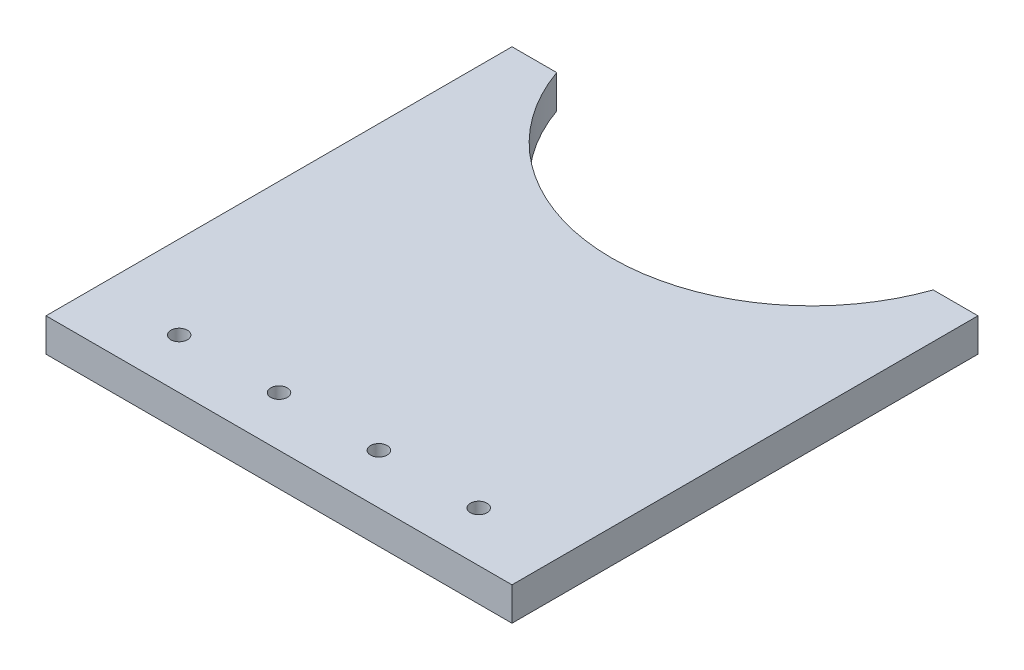
ISO-10303-21;
HEADER;
FILE_DESCRIPTION(('STEP AP214'),'2;1');
FILE_NAME('part.step','',(''),(''),'','','');
FILE_SCHEMA(('AUTOMOTIVE_DESIGN { 1 0 10303 214 1 1 1 1 }'));
ENDSEC;
DATA;
#1=APPLICATION_CONTEXT('core data for automotive mechanical design processes');
#2=APPLICATION_PROTOCOL_DEFINITION('international standard','automotive_design',2000,#1);
#3=PRODUCT_CONTEXT('',#1,'mechanical');
#4=PRODUCT('Part','Part','',(#3));
#5=PRODUCT_RELATED_PRODUCT_CATEGORY('part','',(#4));
#6=PRODUCT_DEFINITION_FORMATION('','',#4);
#7=PRODUCT_DEFINITION_CONTEXT('part definition',#1,'design');
#8=PRODUCT_DEFINITION('design','',#6,#7);
#9=PRODUCT_DEFINITION_SHAPE('','',#8);
#10=(LENGTH_UNIT() NAMED_UNIT(*) SI_UNIT(.MILLI.,.METRE.));
#11=(NAMED_UNIT(*) PLANE_ANGLE_UNIT() SI_UNIT($,.RADIAN.));
#12=(NAMED_UNIT(*) SI_UNIT($,.STERADIAN.) SOLID_ANGLE_UNIT());
#13=UNCERTAINTY_MEASURE_WITH_UNIT(LENGTH_MEASURE(1.E-05),#10,'distance_accuracy_value','');
#14=(GEOMETRIC_REPRESENTATION_CONTEXT(3) GLOBAL_UNCERTAINTY_ASSIGNED_CONTEXT((#13)) GLOBAL_UNIT_ASSIGNED_CONTEXT((#10,
#11,#12)) REPRESENTATION_CONTEXT('',''));
#15=CARTESIAN_POINT('',(0.,0.,0.));
#16=DIRECTION('',(0.,0.,1.));
#17=DIRECTION('',(1.,0.,0.));
#18=AXIS2_PLACEMENT_3D('',#15,#16,#17);
#19=CARTESIAN_POINT('',(-88.9,12.7,25.4));
#20=DIRECTION('',(1.,0.,0.));
#21=DIRECTION('',(0.,0.,-1.));
#22=AXIS2_PLACEMENT_3D('',#19,#20,#21);
#23=PLANE('',#22);
#24=DIRECTION('',(0.,0.,1.));
#25=VECTOR('',#24,1.);
#26=CARTESIAN_POINT('',(-88.9,0.,25.4));
#27=LINE('',#26,#25);
#28=CARTESIAN_POINT('',(-88.9,0.,25.4));
#29=VERTEX_POINT('',#28);
#30=CARTESIAN_POINT('',(-88.9,0.,203.2));
#31=VERTEX_POINT('',#30);
#32=EDGE_CURVE('E115',#29,#31,#27,.T.);
#33=ORIENTED_EDGE('',*,*,#32,.T.);
#34=DIRECTION('',(0.,-1.,0.));
#35=VECTOR('',#34,1.);
#36=CARTESIAN_POINT('',(-88.9,12.7,203.2));
#37=LINE('',#36,#35);
#38=CARTESIAN_POINT('',(-88.9,12.7,203.2));
#39=VERTEX_POINT('',#38);
#40=EDGE_CURVE('E11',#39,#31,#37,.T.);
#41=ORIENTED_EDGE('',*,*,#40,.F.);
#42=DIRECTION('',(0.,0.,1.));
#43=VECTOR('',#42,1.);
#44=CARTESIAN_POINT('',(-88.9,12.7,25.4));
#45=LINE('',#44,#43);
#46=CARTESIAN_POINT('',(-88.9,12.7,25.4));
#47=VERTEX_POINT('',#46);
#48=EDGE_CURVE('E126',#47,#39,#45,.T.);
#49=ORIENTED_EDGE('',*,*,#48,.F.);
#50=DIRECTION('',(0.,-1.,0.));
#51=VECTOR('',#50,1.);
#52=CARTESIAN_POINT('',(-88.9,12.7,25.4));
#53=LINE('',#52,#51);
#54=EDGE_CURVE('E111',#47,#29,#53,.T.);
#55=ORIENTED_EDGE('',*,*,#54,.T.);
#56=EDGE_LOOP('',(#33,#41,#49,#55));
#57=FACE_BOUND('',#56,.T.);
#58=ADVANCED_FACE('F31',(#57),#23,.F.);
#59=CARTESIAN_POINT('',(-88.9,12.7,203.2));
#60=DIRECTION('',(0.,0.,-1.));
#61=DIRECTION('',(-1.,0.,0.));
#62=AXIS2_PLACEMENT_3D('',#59,#60,#61);
#63=PLANE('',#62);
#64=DIRECTION('',(1.,0.,0.));
#65=VECTOR('',#64,1.);
#66=CARTESIAN_POINT('',(-88.9,0.,203.2));
#67=LINE('',#66,#65);
#68=CARTESIAN_POINT('',(88.9,0.,203.2));
#69=VERTEX_POINT('',#68);
#70=EDGE_CURVE('E118',#31,#69,#67,.T.);
#71=ORIENTED_EDGE('',*,*,#70,.T.);
#72=DIRECTION('',(0.,-1.,0.));
#73=VECTOR('',#72,1.);
#74=CARTESIAN_POINT('',(88.9,12.7,203.2));
#75=LINE('',#74,#73);
#76=CARTESIAN_POINT('',(88.9,12.7,203.2));
#77=VERTEX_POINT('',#76);
#78=EDGE_CURVE('E39',#77,#69,#75,.T.);
#79=ORIENTED_EDGE('',*,*,#78,.F.);
#80=DIRECTION('',(1.,0.,0.));
#81=VECTOR('',#80,1.);
#82=CARTESIAN_POINT('',(-88.9,12.7,203.2));
#83=LINE('',#82,#81);
#84=EDGE_CURVE('E84',#39,#77,#83,.T.);
#85=ORIENTED_EDGE('',*,*,#84,.F.);
#86=ORIENTED_EDGE('',*,*,#40,.T.);
#87=EDGE_LOOP('',(#71,#79,#85,#86));
#88=FACE_BOUND('',#87,.T.);
#89=ADVANCED_FACE('F152',(#88),#63,.F.);
#90=CARTESIAN_POINT('',(88.9,12.7,25.4));
#91=DIRECTION('',(-1.,0.,0.));
#92=DIRECTION('',(0.,0.,1.));
#93=AXIS2_PLACEMENT_3D('',#90,#91,#92);
#94=PLANE('',#93);
#95=DIRECTION('',(0.,0.,-1.));
#96=VECTOR('',#95,1.);
#97=CARTESIAN_POINT('',(88.9,0.,25.4));
#98=LINE('',#97,#96);
#99=CARTESIAN_POINT('',(88.9,0.,25.4));
#100=VERTEX_POINT('',#99);
#101=EDGE_CURVE('E121',#69,#100,#98,.T.);
#102=ORIENTED_EDGE('',*,*,#101,.T.);
#103=DIRECTION('',(0.,-1.,0.));
#104=VECTOR('',#103,1.);
#105=CARTESIAN_POINT('',(88.9,12.7,25.4));
#106=LINE('',#105,#104);
#107=CARTESIAN_POINT('',(88.9,12.7,25.4));
#108=VERTEX_POINT('',#107);
#109=EDGE_CURVE('E106',#108,#100,#106,.T.);
#110=ORIENTED_EDGE('',*,*,#109,.F.);
#111=DIRECTION('',(0.,0.,-1.));
#112=VECTOR('',#111,1.);
#113=CARTESIAN_POINT('',(88.9,12.7,25.4));
#114=LINE('',#113,#112);
#115=EDGE_CURVE('E97',#77,#108,#114,.T.);
#116=ORIENTED_EDGE('',*,*,#115,.F.);
#117=ORIENTED_EDGE('',*,*,#78,.T.);
#118=EDGE_LOOP('',(#102,#110,#116,#117));
#119=FACE_BOUND('',#118,.T.);
#120=ADVANCED_FACE('F132',(#119),#94,.F.);
#121=CARTESIAN_POINT('',(71.8420489685532,12.7,25.4));
#122=DIRECTION('',(0.,0.,1.));
#123=DIRECTION('',(1.,0.,0.));
#124=AXIS2_PLACEMENT_3D('',#121,#122,#123);
#125=PLANE('',#124);
#126=DIRECTION('',(-1.,0.,0.));
#127=VECTOR('',#126,1.);
#128=CARTESIAN_POINT('',(71.8420489685532,0.,25.4));
#129=LINE('',#128,#127);
#130=CARTESIAN_POINT('',(71.8420489685532,0.,25.4));
#131=VERTEX_POINT('',#130);
#132=EDGE_CURVE('E105',#100,#131,#129,.T.);
#133=ORIENTED_EDGE('',*,*,#132,.T.);
#134=DIRECTION('',(0.,-1.,0.));
#135=VECTOR('',#134,1.);
#136=CARTESIAN_POINT('',(71.8420489685532,12.7,25.4));
#137=LINE('',#136,#135);
#138=CARTESIAN_POINT('',(71.8420489685532,12.7,25.4));
#139=VERTEX_POINT('',#138);
#140=EDGE_CURVE('E102',#139,#131,#137,.T.);
#141=ORIENTED_EDGE('',*,*,#140,.F.);
#142=DIRECTION('',(-1.,0.,0.));
#143=VECTOR('',#142,1.);
#144=CARTESIAN_POINT('',(71.8420489685532,12.7,25.4));
#145=LINE('',#144,#143);
#146=EDGE_CURVE('E91',#108,#139,#145,.T.);
#147=ORIENTED_EDGE('',*,*,#146,.F.);
#148=ORIENTED_EDGE('',*,*,#109,.T.);
#149=EDGE_LOOP('',(#133,#141,#147,#148));
#150=FACE_BOUND('',#149,.T.);
#151=ADVANCED_FACE('F103',(#150),#125,.F.);
#152=CARTESIAN_POINT('',(0.,12.7,0.));
#153=DIRECTION('',(0.,-1.,0.));
#154=DIRECTION('',(0.,0.,-1.));
#155=AXIS2_PLACEMENT_3D('',#152,#153,#154);
#156=CYLINDRICAL_SURFACE('',#155,76.2);
#157=CARTESIAN_POINT('',(0.,0.,0.));
#158=DIRECTION('',(0.,-1.,0.));
#159=DIRECTION('',(0.,0.,1.));
#160=AXIS2_PLACEMENT_3D('',#157,#158,#159);
#161=CIRCLE('',#160,76.2);
#162=CARTESIAN_POINT('',(-71.8420489685532,0.,25.4));
#163=VERTEX_POINT('',#162);
#164=EDGE_CURVE('E70',#131,#163,#161,.T.);
#165=ORIENTED_EDGE('',*,*,#164,.T.);
#166=DIRECTION('',(0.,-1.,0.));
#167=VECTOR('',#166,1.);
#168=CARTESIAN_POINT('',(-71.8420489685532,12.7,25.4));
#169=LINE('',#168,#167);
#170=CARTESIAN_POINT('',(-71.8420489685532,12.7,25.4));
#171=VERTEX_POINT('',#170);
#172=EDGE_CURVE('E107',#171,#163,#169,.T.);
#173=ORIENTED_EDGE('',*,*,#172,.F.);
#174=CARTESIAN_POINT('',(0.,12.7,0.));
#175=DIRECTION('',(0.,-1.,0.));
#176=DIRECTION('',(0.,0.,1.));
#177=AXIS2_PLACEMENT_3D('',#174,#175,#176);
#178=CIRCLE('',#177,76.2);
#179=EDGE_CURVE('E95',#139,#171,#178,.T.);
#180=ORIENTED_EDGE('',*,*,#179,.F.);
#181=ORIENTED_EDGE('',*,*,#140,.T.);
#182=EDGE_LOOP('',(#165,#173,#180,#181));
#183=FACE_BOUND('',#182,.T.);
#184=ADVANCED_FACE('F109',(#183),#156,.F.);
#185=CARTESIAN_POINT('',(-88.9,12.7,25.4));
#186=DIRECTION('',(0.,0.,1.));
#187=DIRECTION('',(1.,0.,0.));
#188=AXIS2_PLACEMENT_3D('',#185,#186,#187);
#189=PLANE('',#188);
#190=DIRECTION('',(-1.,0.,0.));
#191=VECTOR('',#190,1.);
#192=CARTESIAN_POINT('',(-88.9,0.,25.4));
#193=LINE('',#192,#191);
#194=EDGE_CURVE('E76',#163,#29,#193,.T.);
#195=ORIENTED_EDGE('',*,*,#194,.T.);
#196=ORIENTED_EDGE('',*,*,#54,.F.);
#197=DIRECTION('',(-1.,0.,0.));
#198=VECTOR('',#197,1.);
#199=CARTESIAN_POINT('',(-88.9,12.7,25.4));
#200=LINE('',#199,#198);
#201=EDGE_CURVE('E47',#171,#47,#200,.T.);
#202=ORIENTED_EDGE('',*,*,#201,.F.);
#203=ORIENTED_EDGE('',*,*,#172,.T.);
#204=EDGE_LOOP('',(#195,#196,#202,#203));
#205=FACE_BOUND('',#204,.T.);
#206=ADVANCED_FACE('F139',(#205),#189,.F.);
#207=CARTESIAN_POINT('',(0.,12.7,0.));
#208=DIRECTION('',(0.,1.,0.));
#209=DIRECTION('',(0.,0.,1.));
#210=AXIS2_PLACEMENT_3D('',#207,#208,#209);
#211=PLANE('',#210);
#212=CARTESIAN_POINT('',(-57.15,12.7,184.15));
#213=DIRECTION('',(0.,1.,0.));
#214=DIRECTION('',(0.,0.,1.));
#215=AXIS2_PLACEMENT_3D('',#212,#213,#214);
#216=CIRCLE('',#215,3.175);
#217=CARTESIAN_POINT('',(-57.15,12.7,187.325));
#218=VERTEX_POINT('',#217);
#219=EDGE_CURVE('E233',#218,#218,#216,.T.);
#220=ORIENTED_EDGE('',*,*,#219,.F.);
#221=EDGE_LOOP('',(#220));
#222=FACE_BOUND('',#221,.T.);
#223=CARTESIAN_POINT('',(57.15,12.7,184.15));
#224=DIRECTION('',(0.,1.,0.));
#225=DIRECTION('',(0.,0.,1.));
#226=AXIS2_PLACEMENT_3D('',#223,#224,#225);
#227=CIRCLE('',#226,3.175);
#228=CARTESIAN_POINT('',(57.15,12.7,187.325));
#229=VERTEX_POINT('',#228);
#230=EDGE_CURVE('E235',#229,#229,#227,.T.);
#231=ORIENTED_EDGE('',*,*,#230,.F.);
#232=EDGE_LOOP('',(#231));
#233=FACE_BOUND('',#232,.T.);
#234=CARTESIAN_POINT('',(19.05,12.7,184.15));
#235=DIRECTION('',(0.,1.,0.));
#236=DIRECTION('',(0.,0.,1.));
#237=AXIS2_PLACEMENT_3D('',#234,#235,#236);
#238=CIRCLE('',#237,3.175);
#239=CARTESIAN_POINT('',(19.05,12.7,187.325));
#240=VERTEX_POINT('',#239);
#241=EDGE_CURVE('E241',#240,#240,#238,.T.);
#242=ORIENTED_EDGE('',*,*,#241,.F.);
#243=EDGE_LOOP('',(#242));
#244=FACE_BOUND('',#243,.T.);
#245=CARTESIAN_POINT('',(-19.05,12.7,184.15));
#246=DIRECTION('',(0.,1.,0.));
#247=DIRECTION('',(0.,0.,1.));
#248=AXIS2_PLACEMENT_3D('',#245,#246,#247);
#249=CIRCLE('',#248,3.175);
#250=CARTESIAN_POINT('',(-19.05,12.7,187.325));
#251=VERTEX_POINT('',#250);
#252=EDGE_CURVE('E247',#251,#251,#249,.T.);
#253=ORIENTED_EDGE('',*,*,#252,.F.);
#254=EDGE_LOOP('',(#253));
#255=FACE_BOUND('',#254,.T.);
#256=ORIENTED_EDGE('',*,*,#48,.T.);
#257=ORIENTED_EDGE('',*,*,#84,.T.);
#258=ORIENTED_EDGE('',*,*,#115,.T.);
#259=ORIENTED_EDGE('',*,*,#146,.T.);
#260=ORIENTED_EDGE('',*,*,#179,.T.);
#261=ORIENTED_EDGE('',*,*,#201,.T.);
#262=EDGE_LOOP('',(#256,#257,#258,#259,#260,#261));
#263=FACE_BOUND('',#262,.T.);
#264=ADVANCED_FACE('F93',(#222,#233,#244,#255,#263),#211,.T.);
#265=CARTESIAN_POINT('',(0.,0.,0.));
#266=DIRECTION('',(0.,1.,0.));
#267=DIRECTION('',(0.,0.,1.));
#268=AXIS2_PLACEMENT_3D('',#265,#266,#267);
#269=PLANE('',#268);
#270=CARTESIAN_POINT('',(-57.15,0.,184.15));
#271=DIRECTION('',(0.,1.,0.));
#272=DIRECTION('',(0.,0.,1.));
#273=AXIS2_PLACEMENT_3D('',#270,#271,#272);
#274=CIRCLE('',#273,3.175);
#275=CARTESIAN_POINT('',(-57.15,0.,187.325));
#276=VERTEX_POINT('',#275);
#277=EDGE_CURVE('E230',#276,#276,#274,.T.);
#278=ORIENTED_EDGE('',*,*,#277,.T.);
#279=EDGE_LOOP('',(#278));
#280=FACE_BOUND('',#279,.T.);
#281=CARTESIAN_POINT('',(57.15,0.,184.15));
#282=DIRECTION('',(0.,1.,0.));
#283=DIRECTION('',(0.,0.,1.));
#284=AXIS2_PLACEMENT_3D('',#281,#282,#283);
#285=CIRCLE('',#284,3.175);
#286=CARTESIAN_POINT('',(57.15,0.,187.325));
#287=VERTEX_POINT('',#286);
#288=EDGE_CURVE('E238',#287,#287,#285,.T.);
#289=ORIENTED_EDGE('',*,*,#288,.T.);
#290=EDGE_LOOP('',(#289));
#291=FACE_BOUND('',#290,.T.);
#292=CARTESIAN_POINT('',(19.05,0.,184.15));
#293=DIRECTION('',(0.,1.,0.));
#294=DIRECTION('',(0.,0.,1.));
#295=AXIS2_PLACEMENT_3D('',#292,#293,#294);
#296=CIRCLE('',#295,3.175);
#297=CARTESIAN_POINT('',(19.05,0.,187.325));
#298=VERTEX_POINT('',#297);
#299=EDGE_CURVE('E244',#298,#298,#296,.T.);
#300=ORIENTED_EDGE('',*,*,#299,.T.);
#301=EDGE_LOOP('',(#300));
#302=FACE_BOUND('',#301,.T.);
#303=CARTESIAN_POINT('',(-19.05,0.,184.15));
#304=DIRECTION('',(0.,1.,0.));
#305=DIRECTION('',(0.,0.,1.));
#306=AXIS2_PLACEMENT_3D('',#303,#304,#305);
#307=CIRCLE('',#306,3.175);
#308=CARTESIAN_POINT('',(-19.05,0.,187.325));
#309=VERTEX_POINT('',#308);
#310=EDGE_CURVE('E119',#309,#309,#307,.T.);
#311=ORIENTED_EDGE('',*,*,#310,.T.);
#312=EDGE_LOOP('',(#311));
#313=FACE_BOUND('',#312,.T.);
#314=ORIENTED_EDGE('',*,*,#32,.F.);
#315=ORIENTED_EDGE('',*,*,#194,.F.);
#316=ORIENTED_EDGE('',*,*,#164,.F.);
#317=ORIENTED_EDGE('',*,*,#132,.F.);
#318=ORIENTED_EDGE('',*,*,#101,.F.);
#319=ORIENTED_EDGE('',*,*,#70,.F.);
#320=EDGE_LOOP('',(#314,#315,#316,#317,#318,#319));
#321=FACE_BOUND('',#320,.T.);
#322=ADVANCED_FACE('F135',(#280,#291,#302,#313,#321),#269,.F.);
#323=CARTESIAN_POINT('',(-19.05,0.,184.15));
#324=DIRECTION('',(0.,1.,0.));
#325=DIRECTION('',(0.,0.,1.));
#326=AXIS2_PLACEMENT_3D('',#323,#324,#325);
#327=CYLINDRICAL_SURFACE('',#326,3.175);
#328=ORIENTED_EDGE('',*,*,#310,.F.);
#329=EDGE_LOOP('',(#328));
#330=FACE_BOUND('',#329,.T.);
#331=ORIENTED_EDGE('',*,*,#252,.T.);
#332=EDGE_LOOP('',(#331));
#333=FACE_BOUND('',#332,.T.);
#334=ADVANCED_FACE('F185',(#330,#333),#327,.F.);
#335=CARTESIAN_POINT('',(19.05,0.,184.15));
#336=DIRECTION('',(0.,1.,0.));
#337=DIRECTION('',(0.,0.,1.));
#338=AXIS2_PLACEMENT_3D('',#335,#336,#337);
#339=CYLINDRICAL_SURFACE('',#338,3.175);
#340=ORIENTED_EDGE('',*,*,#299,.F.);
#341=EDGE_LOOP('',(#340));
#342=FACE_BOUND('',#341,.T.);
#343=ORIENTED_EDGE('',*,*,#241,.T.);
#344=EDGE_LOOP('',(#343));
#345=FACE_BOUND('',#344,.T.);
#346=ADVANCED_FACE('F193',(#342,#345),#339,.F.);
#347=CARTESIAN_POINT('',(57.15,0.,184.15));
#348=DIRECTION('',(0.,1.,0.));
#349=DIRECTION('',(0.,0.,1.));
#350=AXIS2_PLACEMENT_3D('',#347,#348,#349);
#351=CYLINDRICAL_SURFACE('',#350,3.175);
#352=ORIENTED_EDGE('',*,*,#288,.F.);
#353=EDGE_LOOP('',(#352));
#354=FACE_BOUND('',#353,.T.);
#355=ORIENTED_EDGE('',*,*,#230,.T.);
#356=EDGE_LOOP('',(#355));
#357=FACE_BOUND('',#356,.T.);
#358=ADVANCED_FACE('F203',(#354,#357),#351,.F.);
#359=CARTESIAN_POINT('',(-57.15,0.,184.15));
#360=DIRECTION('',(0.,1.,0.));
#361=DIRECTION('',(0.,0.,1.));
#362=AXIS2_PLACEMENT_3D('',#359,#360,#361);
#363=CYLINDRICAL_SURFACE('',#362,3.175);
#364=ORIENTED_EDGE('',*,*,#277,.F.);
#365=EDGE_LOOP('',(#364));
#366=FACE_BOUND('',#365,.T.);
#367=ORIENTED_EDGE('',*,*,#219,.T.);
#368=EDGE_LOOP('',(#367));
#369=FACE_BOUND('',#368,.T.);
#370=ADVANCED_FACE('F213',(#366,#369),#363,.F.);
#371=CLOSED_SHELL('',(#58,#89,#120,#151,#184,#206,#264,#322,#334,#346,#358,#370));
#372=MANIFOLD_SOLID_BREP('B2',#371);
#373=ADVANCED_BREP_SHAPE_REPRESENTATION('',(#18,#372),#14);
#374=SHAPE_DEFINITION_REPRESENTATION(#9,#373);
ENDSEC;
END-ISO-10303-21;
